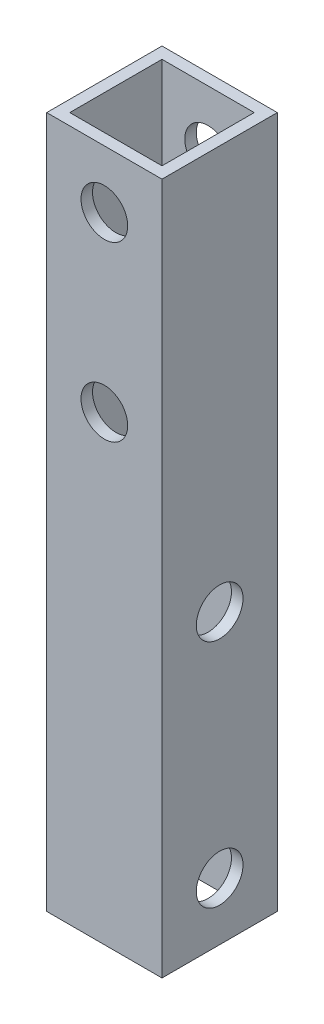
ISO-10303-21;
HEADER;
FILE_DESCRIPTION(('STEP AP214'),'2;1');
FILE_NAME('part.step','',(''),(''),'','','');
FILE_SCHEMA(('AUTOMOTIVE_DESIGN { 1 0 10303 214 1 1 1 1 }'));
ENDSEC;
DATA;
#1=APPLICATION_CONTEXT('core data for automotive mechanical design processes');
#2=APPLICATION_PROTOCOL_DEFINITION('international standard','automotive_design',2000,#1);
#3=PRODUCT_CONTEXT('',#1,'mechanical');
#4=PRODUCT('Part','Part','',(#3));
#5=PRODUCT_RELATED_PRODUCT_CATEGORY('part','',(#4));
#6=PRODUCT_DEFINITION_FORMATION('','',#4);
#7=PRODUCT_DEFINITION_CONTEXT('part definition',#1,'design');
#8=PRODUCT_DEFINITION('design','',#6,#7);
#9=PRODUCT_DEFINITION_SHAPE('','',#8);
#10=(LENGTH_UNIT() NAMED_UNIT(*) SI_UNIT(.MILLI.,.METRE.));
#11=(NAMED_UNIT(*) PLANE_ANGLE_UNIT() SI_UNIT($,.RADIAN.));
#12=(NAMED_UNIT(*) SI_UNIT($,.STERADIAN.) SOLID_ANGLE_UNIT());
#13=UNCERTAINTY_MEASURE_WITH_UNIT(LENGTH_MEASURE(1.E-05),#10,'distance_accuracy_value','');
#14=(GEOMETRIC_REPRESENTATION_CONTEXT(3) GLOBAL_UNCERTAINTY_ASSIGNED_CONTEXT((#13)) GLOBAL_UNIT_ASSIGNED_CONTEXT((#10,
#11,#12)) REPRESENTATION_CONTEXT('',''));
#15=CARTESIAN_POINT('',(0.,0.,0.));
#16=DIRECTION('',(0.,0.,1.));
#17=DIRECTION('',(1.,0.,0.));
#18=AXIS2_PLACEMENT_3D('',#15,#16,#17);
#19=CARTESIAN_POINT('',(0.,60.,0.));
#20=DIRECTION('',(0.,1.,0.));
#21=DIRECTION('',(0.,0.,1.));
#22=AXIS2_PLACEMENT_3D('',#19,#20,#21);
#23=PLANE('',#22);
#24=DIRECTION('',(0.,0.,-1.));
#25=VECTOR('',#24,1.);
#26=CARTESIAN_POINT('',(5.,60.,-5.));
#27=LINE('',#26,#25);
#28=CARTESIAN_POINT('',(5.,60.,5.));
#29=VERTEX_POINT('',#28);
#30=CARTESIAN_POINT('',(5.,60.,-5.));
#31=VERTEX_POINT('',#30);
#32=EDGE_CURVE('E156',#29,#31,#27,.T.);
#33=ORIENTED_EDGE('',*,*,#32,.T.);
#34=DIRECTION('',(-1.,0.,0.));
#35=VECTOR('',#34,1.);
#36=CARTESIAN_POINT('',(-5.,60.,-5.));
#37=LINE('',#36,#35);
#38=CARTESIAN_POINT('',(-5.,60.,-5.));
#39=VERTEX_POINT('',#38);
#40=EDGE_CURVE('E160',#31,#39,#37,.T.);
#41=ORIENTED_EDGE('',*,*,#40,.T.);
#42=DIRECTION('',(0.,0.,1.));
#43=VECTOR('',#42,1.);
#44=CARTESIAN_POINT('',(-5.,60.,-5.));
#45=LINE('',#44,#43);
#46=CARTESIAN_POINT('',(-5.,60.,5.));
#47=VERTEX_POINT('',#46);
#48=EDGE_CURVE('E164',#39,#47,#45,.T.);
#49=ORIENTED_EDGE('',*,*,#48,.T.);
#50=DIRECTION('',(1.,0.,0.));
#51=VECTOR('',#50,1.);
#52=CARTESIAN_POINT('',(-5.,60.,5.));
#53=LINE('',#52,#51);
#54=EDGE_CURVE('E167',#47,#29,#53,.T.);
#55=ORIENTED_EDGE('',*,*,#54,.T.);
#56=EDGE_LOOP('',(#33,#41,#49,#55));
#57=FACE_BOUND('',#56,.T.);
#58=DIRECTION('',(-1.,0.,0.));
#59=VECTOR('',#58,1.);
#60=CARTESIAN_POINT('',(-4.,60.,-4.));
#61=LINE('',#60,#59);
#62=CARTESIAN_POINT('',(4.,60.,-4.));
#63=VERTEX_POINT('',#62);
#64=CARTESIAN_POINT('',(-4.,60.,-4.));
#65=VERTEX_POINT('',#64);
#66=EDGE_CURVE('E115',#63,#65,#61,.T.);
#67=ORIENTED_EDGE('',*,*,#66,.F.);
#68=DIRECTION('',(0.,0.,-1.));
#69=VECTOR('',#68,1.);
#70=CARTESIAN_POINT('',(4.,60.,-4.));
#71=LINE('',#70,#69);
#72=CARTESIAN_POINT('',(4.,60.,4.));
#73=VERTEX_POINT('',#72);
#74=EDGE_CURVE('E106',#73,#63,#71,.T.);
#75=ORIENTED_EDGE('',*,*,#74,.F.);
#76=DIRECTION('',(1.,0.,0.));
#77=VECTOR('',#76,1.);
#78=CARTESIAN_POINT('',(-4.,60.,4.));
#79=LINE('',#78,#77);
#80=CARTESIAN_POINT('',(-4.,60.,4.));
#81=VERTEX_POINT('',#80);
#82=EDGE_CURVE('E132',#81,#73,#79,.T.);
#83=ORIENTED_EDGE('',*,*,#82,.F.);
#84=DIRECTION('',(0.,0.,1.));
#85=VECTOR('',#84,1.);
#86=CARTESIAN_POINT('',(-4.,60.,-4.));
#87=LINE('',#86,#85);
#88=EDGE_CURVE('E128',#65,#81,#87,.T.);
#89=ORIENTED_EDGE('',*,*,#88,.F.);
#90=EDGE_LOOP('',(#67,#75,#83,#89));
#91=FACE_BOUND('',#90,.T.);
#92=ADVANCED_FACE('F38',(#57,#91),#23,.T.);
#93=CARTESIAN_POINT('',(0.,0.,0.));
#94=DIRECTION('',(0.,1.,0.));
#95=DIRECTION('',(0.,0.,1.));
#96=AXIS2_PLACEMENT_3D('',#93,#94,#95);
#97=PLANE('',#96);
#98=DIRECTION('',(0.,0.,-1.));
#99=VECTOR('',#98,1.);
#100=CARTESIAN_POINT('',(5.,0.,-5.));
#101=LINE('',#100,#99);
#102=CARTESIAN_POINT('',(5.,0.,5.));
#103=VERTEX_POINT('',#102);
#104=CARTESIAN_POINT('',(5.,0.,-5.));
#105=VERTEX_POINT('',#104);
#106=EDGE_CURVE('E124',#103,#105,#101,.T.);
#107=ORIENTED_EDGE('',*,*,#106,.F.);
#108=DIRECTION('',(1.,0.,0.));
#109=VECTOR('',#108,1.);
#110=CARTESIAN_POINT('',(-5.,0.,5.));
#111=LINE('',#110,#109);
#112=CARTESIAN_POINT('',(-5.,0.,5.));
#113=VERTEX_POINT('',#112);
#114=EDGE_CURVE('E161',#113,#103,#111,.T.);
#115=ORIENTED_EDGE('',*,*,#114,.F.);
#116=DIRECTION('',(0.,0.,1.));
#117=VECTOR('',#116,1.);
#118=CARTESIAN_POINT('',(-5.,0.,-5.));
#119=LINE('',#118,#117);
#120=CARTESIAN_POINT('',(-5.,0.,-5.));
#121=VERTEX_POINT('',#120);
#122=EDGE_CURVE('E177',#121,#113,#119,.T.);
#123=ORIENTED_EDGE('',*,*,#122,.F.);
#124=DIRECTION('',(-1.,0.,0.));
#125=VECTOR('',#124,1.);
#126=CARTESIAN_POINT('',(-5.,0.,-5.));
#127=LINE('',#126,#125);
#128=EDGE_CURVE('E174',#105,#121,#127,.T.);
#129=ORIENTED_EDGE('',*,*,#128,.F.);
#130=EDGE_LOOP('',(#107,#115,#123,#129));
#131=FACE_BOUND('',#130,.T.);
#132=DIRECTION('',(0.,0.,-1.));
#133=VECTOR('',#132,1.);
#134=CARTESIAN_POINT('',(4.,0.,-4.));
#135=LINE('',#134,#133);
#136=CARTESIAN_POINT('',(4.,0.,4.));
#137=VERTEX_POINT('',#136);
#138=CARTESIAN_POINT('',(4.,0.,-4.));
#139=VERTEX_POINT('',#138);
#140=EDGE_CURVE('E64',#137,#139,#135,.T.);
#141=ORIENTED_EDGE('',*,*,#140,.T.);
#142=DIRECTION('',(-1.,0.,0.));
#143=VECTOR('',#142,1.);
#144=CARTESIAN_POINT('',(-4.,0.,-4.));
#145=LINE('',#144,#143);
#146=CARTESIAN_POINT('',(-4.,0.,-4.));
#147=VERTEX_POINT('',#146);
#148=EDGE_CURVE('E122',#139,#147,#145,.T.);
#149=ORIENTED_EDGE('',*,*,#148,.T.);
#150=DIRECTION('',(0.,0.,1.));
#151=VECTOR('',#150,1.);
#152=CARTESIAN_POINT('',(-4.,0.,-4.));
#153=LINE('',#152,#151);
#154=CARTESIAN_POINT('',(-4.,0.,4.));
#155=VERTEX_POINT('',#154);
#156=EDGE_CURVE('E143',#147,#155,#153,.T.);
#157=ORIENTED_EDGE('',*,*,#156,.T.);
#158=DIRECTION('',(1.,0.,0.));
#159=VECTOR('',#158,1.);
#160=CARTESIAN_POINT('',(-4.,0.,4.));
#161=LINE('',#160,#159);
#162=EDGE_CURVE('E116',#155,#137,#161,.T.);
#163=ORIENTED_EDGE('',*,*,#162,.T.);
#164=EDGE_LOOP('',(#141,#149,#157,#163));
#165=FACE_BOUND('',#164,.T.);
#166=ADVANCED_FACE('F274',(#131,#165),#97,.F.);
#167=CARTESIAN_POINT('',(5.,60.,-5.));
#168=DIRECTION('',(-1.,0.,0.));
#169=DIRECTION('',(0.,0.,1.));
#170=AXIS2_PLACEMENT_3D('',#167,#168,#169);
#171=PLANE('',#170);
#172=CARTESIAN_POINT('',(5.,5.,0.));
#173=DIRECTION('',(1.,0.,0.));
#174=DIRECTION('',(0.,0.,-1.));
#175=AXIS2_PLACEMENT_3D('',#172,#173,#174);
#176=CIRCLE('',#175,2.025);
#177=CARTESIAN_POINT('',(5.,5.,-2.025));
#178=VERTEX_POINT('',#177);
#179=EDGE_CURVE('E237',#178,#178,#176,.T.);
#180=ORIENTED_EDGE('',*,*,#179,.F.);
#181=EDGE_LOOP('',(#180));
#182=FACE_BOUND('',#181,.T.);
#183=CARTESIAN_POINT('',(5.,25.,0.));
#184=DIRECTION('',(1.,0.,0.));
#185=DIRECTION('',(0.,0.,-1.));
#186=AXIS2_PLACEMENT_3D('',#183,#184,#185);
#187=CIRCLE('',#186,2.025);
#188=CARTESIAN_POINT('',(5.,25.,-2.025));
#189=VERTEX_POINT('',#188);
#190=EDGE_CURVE('E233',#189,#189,#187,.T.);
#191=ORIENTED_EDGE('',*,*,#190,.F.);
#192=EDGE_LOOP('',(#191));
#193=FACE_BOUND('',#192,.T.);
#194=ORIENTED_EDGE('',*,*,#106,.T.);
#195=DIRECTION('',(0.,-1.,0.));
#196=VECTOR('',#195,1.);
#197=CARTESIAN_POINT('',(5.,60.,-5.));
#198=LINE('',#197,#196);
#199=EDGE_CURVE('E11',#31,#105,#198,.T.);
#200=ORIENTED_EDGE('',*,*,#199,.F.);
#201=ORIENTED_EDGE('',*,*,#32,.F.);
#202=DIRECTION('',(0.,-1.,0.));
#203=VECTOR('',#202,1.);
#204=CARTESIAN_POINT('',(5.,60.,5.));
#205=LINE('',#204,#203);
#206=EDGE_CURVE('E170',#29,#103,#205,.T.);
#207=ORIENTED_EDGE('',*,*,#206,.T.);
#208=EDGE_LOOP('',(#194,#200,#201,#207));
#209=FACE_BOUND('',#208,.T.);
#210=ADVANCED_FACE('F40',(#182,#193,#209),#171,.F.);
#211=CARTESIAN_POINT('',(-5.,60.,-5.));
#212=DIRECTION('',(0.,0.,1.));
#213=DIRECTION('',(1.,0.,0.));
#214=AXIS2_PLACEMENT_3D('',#211,#212,#213);
#215=PLANE('',#214);
#216=CARTESIAN_POINT('',(0.,55.,-5.));
#217=DIRECTION('',(0.,0.,1.));
#218=DIRECTION('',(1.,0.,0.));
#219=AXIS2_PLACEMENT_3D('',#216,#217,#218);
#220=CIRCLE('',#219,2.025);
#221=CARTESIAN_POINT('',(2.025,55.,-5.));
#222=VERTEX_POINT('',#221);
#223=EDGE_CURVE('E205',#222,#222,#220,.T.);
#224=ORIENTED_EDGE('',*,*,#223,.T.);
#225=EDGE_LOOP('',(#224));
#226=FACE_BOUND('',#225,.T.);
#227=CARTESIAN_POINT('',(0.,40.,-5.));
#228=DIRECTION('',(0.,0.,1.));
#229=DIRECTION('',(1.,0.,0.));
#230=AXIS2_PLACEMENT_3D('',#227,#228,#229);
#231=CIRCLE('',#230,2.025);
#232=CARTESIAN_POINT('',(2.025,40.,-5.));
#233=VERTEX_POINT('',#232);
#234=EDGE_CURVE('E219',#233,#233,#231,.T.);
#235=ORIENTED_EDGE('',*,*,#234,.T.);
#236=EDGE_LOOP('',(#235));
#237=FACE_BOUND('',#236,.T.);
#238=ORIENTED_EDGE('',*,*,#128,.T.);
#239=DIRECTION('',(0.,-1.,0.));
#240=VECTOR('',#239,1.);
#241=CARTESIAN_POINT('',(-5.,60.,-5.));
#242=LINE('',#241,#240);
#243=EDGE_CURVE('E48',#39,#121,#242,.T.);
#244=ORIENTED_EDGE('',*,*,#243,.F.);
#245=ORIENTED_EDGE('',*,*,#40,.F.);
#246=ORIENTED_EDGE('',*,*,#199,.T.);
#247=EDGE_LOOP('',(#238,#244,#245,#246));
#248=FACE_BOUND('',#247,.T.);
#249=ADVANCED_FACE('F273',(#226,#237,#248),#215,.F.);
#250=CARTESIAN_POINT('',(-5.,60.,-5.));
#251=DIRECTION('',(1.,0.,0.));
#252=DIRECTION('',(0.,0.,-1.));
#253=AXIS2_PLACEMENT_3D('',#250,#251,#252);
#254=PLANE('',#253);
#255=CARTESIAN_POINT('',(-5.,5.,0.));
#256=DIRECTION('',(1.,0.,0.));
#257=DIRECTION('',(0.,0.,-1.));
#258=AXIS2_PLACEMENT_3D('',#255,#256,#257);
#259=CIRCLE('',#258,2.025);
#260=CARTESIAN_POINT('',(-5.,5.,-2.025));
#261=VERTEX_POINT('',#260);
#262=EDGE_CURVE('E197',#261,#261,#259,.T.);
#263=ORIENTED_EDGE('',*,*,#262,.T.);
#264=EDGE_LOOP('',(#263));
#265=FACE_BOUND('',#264,.T.);
#266=CARTESIAN_POINT('',(-5.,25.,0.));
#267=DIRECTION('',(1.,0.,0.));
#268=DIRECTION('',(0.,0.,-1.));
#269=AXIS2_PLACEMENT_3D('',#266,#267,#268);
#270=CIRCLE('',#269,2.025);
#271=CARTESIAN_POINT('',(-5.,25.,-2.025));
#272=VERTEX_POINT('',#271);
#273=EDGE_CURVE('E241',#272,#272,#270,.T.);
#274=ORIENTED_EDGE('',*,*,#273,.T.);
#275=EDGE_LOOP('',(#274));
#276=FACE_BOUND('',#275,.T.);
#277=ORIENTED_EDGE('',*,*,#122,.T.);
#278=DIRECTION('',(0.,-1.,0.));
#279=VECTOR('',#278,1.);
#280=CARTESIAN_POINT('',(-5.,60.,5.));
#281=LINE('',#280,#279);
#282=EDGE_CURVE('E185',#47,#113,#281,.T.);
#283=ORIENTED_EDGE('',*,*,#282,.F.);
#284=ORIENTED_EDGE('',*,*,#48,.F.);
#285=ORIENTED_EDGE('',*,*,#243,.T.);
#286=EDGE_LOOP('',(#277,#283,#284,#285));
#287=FACE_BOUND('',#286,.T.);
#288=ADVANCED_FACE('F292',(#265,#276,#287),#254,.F.);
#289=CARTESIAN_POINT('',(-5.,60.,5.));
#290=DIRECTION('',(0.,0.,-1.));
#291=DIRECTION('',(-1.,0.,0.));
#292=AXIS2_PLACEMENT_3D('',#289,#290,#291);
#293=PLANE('',#292);
#294=CARTESIAN_POINT('',(0.,55.,5.));
#295=DIRECTION('',(0.,0.,1.));
#296=DIRECTION('',(1.,0.,0.));
#297=AXIS2_PLACEMENT_3D('',#294,#295,#296);
#298=CIRCLE('',#297,2.025);
#299=CARTESIAN_POINT('',(2.025,55.,5.));
#300=VERTEX_POINT('',#299);
#301=EDGE_CURVE('E213',#300,#300,#298,.T.);
#302=ORIENTED_EDGE('',*,*,#301,.F.);
#303=EDGE_LOOP('',(#302));
#304=FACE_BOUND('',#303,.T.);
#305=CARTESIAN_POINT('',(0.,40.,5.));
#306=DIRECTION('',(0.,0.,1.));
#307=DIRECTION('',(1.,0.,0.));
#308=AXIS2_PLACEMENT_3D('',#305,#306,#307);
#309=CIRCLE('',#308,2.025);
#310=CARTESIAN_POINT('',(2.025,40.,5.));
#311=VERTEX_POINT('',#310);
#312=EDGE_CURVE('E225',#311,#311,#309,.T.);
#313=ORIENTED_EDGE('',*,*,#312,.F.);
#314=EDGE_LOOP('',(#313));
#315=FACE_BOUND('',#314,.T.);
#316=ORIENTED_EDGE('',*,*,#114,.T.);
#317=ORIENTED_EDGE('',*,*,#206,.F.);
#318=ORIENTED_EDGE('',*,*,#54,.F.);
#319=ORIENTED_EDGE('',*,*,#282,.T.);
#320=EDGE_LOOP('',(#316,#317,#318,#319));
#321=FACE_BOUND('',#320,.T.);
#322=ADVANCED_FACE('F259',(#304,#315,#321),#293,.F.);
#323=CARTESIAN_POINT('',(4.,60.,-4.));
#324=DIRECTION('',(-1.,0.,0.));
#325=DIRECTION('',(0.,0.,1.));
#326=AXIS2_PLACEMENT_3D('',#323,#324,#325);
#327=PLANE('',#326);
#328=CARTESIAN_POINT('',(4.,5.,0.));
#329=DIRECTION('',(-1.,0.,0.));
#330=DIRECTION('',(0.,0.,1.));
#331=AXIS2_PLACEMENT_3D('',#328,#329,#330);
#332=CIRCLE('',#331,2.025);
#333=CARTESIAN_POINT('',(4.,5.,2.025));
#334=VERTEX_POINT('',#333);
#335=EDGE_CURVE('E140',#334,#334,#332,.T.);
#336=ORIENTED_EDGE('',*,*,#335,.F.);
#337=EDGE_LOOP('',(#336));
#338=FACE_BOUND('',#337,.T.);
#339=CARTESIAN_POINT('',(4.,25.,0.));
#340=DIRECTION('',(-1.,0.,0.));
#341=DIRECTION('',(0.,0.,1.));
#342=AXIS2_PLACEMENT_3D('',#339,#340,#341);
#343=CIRCLE('',#342,2.025);
#344=CARTESIAN_POINT('',(4.,25.,2.025));
#345=VERTEX_POINT('',#344);
#346=EDGE_CURVE('E196',#345,#345,#343,.T.);
#347=ORIENTED_EDGE('',*,*,#346,.F.);
#348=EDGE_LOOP('',(#347));
#349=FACE_BOUND('',#348,.T.);
#350=ORIENTED_EDGE('',*,*,#140,.F.);
#351=DIRECTION('',(0.,-1.,0.));
#352=VECTOR('',#351,1.);
#353=CARTESIAN_POINT('',(4.,60.,4.));
#354=LINE('',#353,#352);
#355=EDGE_CURVE('E110',#73,#137,#354,.T.);
#356=ORIENTED_EDGE('',*,*,#355,.F.);
#357=ORIENTED_EDGE('',*,*,#74,.T.);
#358=DIRECTION('',(0.,-1.,0.));
#359=VECTOR('',#358,1.);
#360=CARTESIAN_POINT('',(4.,60.,-4.));
#361=LINE('',#360,#359);
#362=EDGE_CURVE('E109',#63,#139,#361,.T.);
#363=ORIENTED_EDGE('',*,*,#362,.T.);
#364=EDGE_LOOP('',(#350,#356,#357,#363));
#365=FACE_BOUND('',#364,.T.);
#366=ADVANCED_FACE('F108',(#338,#349,#365),#327,.T.);
#367=CARTESIAN_POINT('',(-4.,60.,-4.));
#368=DIRECTION('',(0.,0.,1.));
#369=DIRECTION('',(1.,0.,0.));
#370=AXIS2_PLACEMENT_3D('',#367,#368,#369);
#371=PLANE('',#370);
#372=CARTESIAN_POINT('',(0.,55.,-4.));
#373=DIRECTION('',(0.,0.,1.));
#374=DIRECTION('',(1.,0.,0.));
#375=AXIS2_PLACEMENT_3D('',#372,#373,#374);
#376=CIRCLE('',#375,2.025);
#377=CARTESIAN_POINT('',(2.025,55.,-4.));
#378=VERTEX_POINT('',#377);
#379=EDGE_CURVE('E229',#378,#378,#376,.T.);
#380=ORIENTED_EDGE('',*,*,#379,.F.);
#381=EDGE_LOOP('',(#380));
#382=FACE_BOUND('',#381,.T.);
#383=CARTESIAN_POINT('',(0.,40.,-4.));
#384=DIRECTION('',(0.,0.,1.));
#385=DIRECTION('',(1.,0.,0.));
#386=AXIS2_PLACEMENT_3D('',#383,#384,#385);
#387=CIRCLE('',#386,2.025);
#388=CARTESIAN_POINT('',(2.025,40.,-4.));
#389=VERTEX_POINT('',#388);
#390=EDGE_CURVE('E204',#389,#389,#387,.T.);
#391=ORIENTED_EDGE('',*,*,#390,.F.);
#392=EDGE_LOOP('',(#391));
#393=FACE_BOUND('',#392,.T.);
#394=ORIENTED_EDGE('',*,*,#148,.F.);
#395=ORIENTED_EDGE('',*,*,#362,.F.);
#396=ORIENTED_EDGE('',*,*,#66,.T.);
#397=DIRECTION('',(0.,-1.,0.));
#398=VECTOR('',#397,1.);
#399=CARTESIAN_POINT('',(-4.,60.,-4.));
#400=LINE('',#399,#398);
#401=EDGE_CURVE('E125',#65,#147,#400,.T.);
#402=ORIENTED_EDGE('',*,*,#401,.T.);
#403=EDGE_LOOP('',(#394,#395,#396,#402));
#404=FACE_BOUND('',#403,.T.);
#405=ADVANCED_FACE('F119',(#382,#393,#404),#371,.T.);
#406=CARTESIAN_POINT('',(-4.,60.,-4.));
#407=DIRECTION('',(1.,0.,0.));
#408=DIRECTION('',(0.,0.,-1.));
#409=AXIS2_PLACEMENT_3D('',#406,#407,#408);
#410=PLANE('',#409);
#411=CARTESIAN_POINT('',(-4.,5.,0.));
#412=DIRECTION('',(1.,0.,0.));
#413=DIRECTION('',(0.,0.,-1.));
#414=AXIS2_PLACEMENT_3D('',#411,#412,#413);
#415=CIRCLE('',#414,2.025);
#416=CARTESIAN_POINT('',(-4.,5.,-2.025));
#417=VERTEX_POINT('',#416);
#418=EDGE_CURVE('E198',#417,#417,#415,.T.);
#419=ORIENTED_EDGE('',*,*,#418,.F.);
#420=EDGE_LOOP('',(#419));
#421=FACE_BOUND('',#420,.T.);
#422=CARTESIAN_POINT('',(-4.,25.,0.));
#423=DIRECTION('',(1.,0.,0.));
#424=DIRECTION('',(0.,0.,-1.));
#425=AXIS2_PLACEMENT_3D('',#422,#423,#424);
#426=CIRCLE('',#425,2.025);
#427=CARTESIAN_POINT('',(-4.,25.,-2.025));
#428=VERTEX_POINT('',#427);
#429=EDGE_CURVE('E192',#428,#428,#426,.T.);
#430=ORIENTED_EDGE('',*,*,#429,.F.);
#431=EDGE_LOOP('',(#430));
#432=FACE_BOUND('',#431,.T.);
#433=ORIENTED_EDGE('',*,*,#156,.F.);
#434=ORIENTED_EDGE('',*,*,#401,.F.);
#435=ORIENTED_EDGE('',*,*,#88,.T.);
#436=DIRECTION('',(0.,-1.,0.));
#437=VECTOR('',#436,1.);
#438=CARTESIAN_POINT('',(-4.,60.,4.));
#439=LINE('',#438,#437);
#440=EDGE_CURVE('E56',#81,#155,#439,.T.);
#441=ORIENTED_EDGE('',*,*,#440,.T.);
#442=EDGE_LOOP('',(#433,#434,#435,#441));
#443=FACE_BOUND('',#442,.T.);
#444=ADVANCED_FACE('F312',(#421,#432,#443),#410,.T.);
#445=CARTESIAN_POINT('',(-4.,60.,4.));
#446=DIRECTION('',(0.,0.,-1.));
#447=DIRECTION('',(-1.,0.,0.));
#448=AXIS2_PLACEMENT_3D('',#445,#446,#447);
#449=PLANE('',#448);
#450=CARTESIAN_POINT('',(0.,55.,4.));
#451=DIRECTION('',(0.,0.,-1.));
#452=DIRECTION('',(-1.,0.,0.));
#453=AXIS2_PLACEMENT_3D('',#450,#451,#452);
#454=CIRCLE('',#453,2.025);
#455=CARTESIAN_POINT('',(-2.025,55.,4.));
#456=VERTEX_POINT('',#455);
#457=EDGE_CURVE('E42',#456,#456,#454,.T.);
#458=ORIENTED_EDGE('',*,*,#457,.F.);
#459=EDGE_LOOP('',(#458));
#460=FACE_BOUND('',#459,.T.);
#461=CARTESIAN_POINT('',(0.,40.,4.));
#462=DIRECTION('',(0.,0.,-1.));
#463=DIRECTION('',(-1.,0.,0.));
#464=AXIS2_PLACEMENT_3D('',#461,#462,#463);
#465=CIRCLE('',#464,2.025);
#466=CARTESIAN_POINT('',(-2.025,40.,4.));
#467=VERTEX_POINT('',#466);
#468=EDGE_CURVE('E201',#467,#467,#465,.T.);
#469=ORIENTED_EDGE('',*,*,#468,.F.);
#470=EDGE_LOOP('',(#469));
#471=FACE_BOUND('',#470,.T.);
#472=ORIENTED_EDGE('',*,*,#162,.F.);
#473=ORIENTED_EDGE('',*,*,#440,.F.);
#474=ORIENTED_EDGE('',*,*,#82,.T.);
#475=ORIENTED_EDGE('',*,*,#355,.T.);
#476=EDGE_LOOP('',(#472,#473,#474,#475));
#477=FACE_BOUND('',#476,.T.);
#478=ADVANCED_FACE('F316',(#460,#471,#477),#449,.T.);
#479=CARTESIAN_POINT('',(-5.,25.,0.));
#480=DIRECTION('',(1.,0.,0.));
#481=DIRECTION('',(0.,0.,-1.));
#482=AXIS2_PLACEMENT_3D('',#479,#480,#481);
#483=CYLINDRICAL_SURFACE('',#482,2.025);
#484=ORIENTED_EDGE('',*,*,#429,.T.);
#485=EDGE_LOOP('',(#484));
#486=FACE_BOUND('',#485,.T.);
#487=ORIENTED_EDGE('',*,*,#273,.F.);
#488=EDGE_LOOP('',(#487));
#489=FACE_BOUND('',#488,.T.);
#490=ADVANCED_FACE('F268',(#486,#489),#483,.F.);
#491=CARTESIAN_POINT('',(-5.,5.,0.));
#492=DIRECTION('',(1.,0.,0.));
#493=DIRECTION('',(0.,0.,-1.));
#494=AXIS2_PLACEMENT_3D('',#491,#492,#493);
#495=CYLINDRICAL_SURFACE('',#494,2.025);
#496=ORIENTED_EDGE('',*,*,#418,.T.);
#497=EDGE_LOOP('',(#496));
#498=FACE_BOUND('',#497,.T.);
#499=ORIENTED_EDGE('',*,*,#262,.F.);
#500=EDGE_LOOP('',(#499));
#501=FACE_BOUND('',#500,.T.);
#502=ADVANCED_FACE('F266',(#498,#501),#495,.F.);
#503=ORIENTED_EDGE('',*,*,#346,.T.);
#504=EDGE_LOOP('',(#503));
#505=FACE_BOUND('',#504,.T.);
#506=ORIENTED_EDGE('',*,*,#190,.T.);
#507=EDGE_LOOP('',(#506));
#508=FACE_BOUND('',#507,.T.);
#509=ADVANCED_FACE('F263',(#505,#508),#483,.F.);
#510=ORIENTED_EDGE('',*,*,#335,.T.);
#511=EDGE_LOOP('',(#510));
#512=FACE_BOUND('',#511,.T.);
#513=ORIENTED_EDGE('',*,*,#179,.T.);
#514=EDGE_LOOP('',(#513));
#515=FACE_BOUND('',#514,.T.);
#516=ADVANCED_FACE('F254',(#512,#515),#495,.F.);
#517=CARTESIAN_POINT('',(0.,40.,-5.));
#518=DIRECTION('',(0.,0.,1.));
#519=DIRECTION('',(1.,0.,0.));
#520=AXIS2_PLACEMENT_3D('',#517,#518,#519);
#521=CYLINDRICAL_SURFACE('',#520,2.025);
#522=ORIENTED_EDGE('',*,*,#468,.T.);
#523=EDGE_LOOP('',(#522));
#524=FACE_BOUND('',#523,.T.);
#525=ORIENTED_EDGE('',*,*,#312,.T.);
#526=EDGE_LOOP('',(#525));
#527=FACE_BOUND('',#526,.T.);
#528=ADVANCED_FACE('F326',(#524,#527),#521,.F.);
#529=CARTESIAN_POINT('',(0.,55.,-5.));
#530=DIRECTION('',(0.,0.,1.));
#531=DIRECTION('',(1.,0.,0.));
#532=AXIS2_PLACEMENT_3D('',#529,#530,#531);
#533=CYLINDRICAL_SURFACE('',#532,2.025);
#534=ORIENTED_EDGE('',*,*,#457,.T.);
#535=EDGE_LOOP('',(#534));
#536=FACE_BOUND('',#535,.T.);
#537=ORIENTED_EDGE('',*,*,#301,.T.);
#538=EDGE_LOOP('',(#537));
#539=FACE_BOUND('',#538,.T.);
#540=ADVANCED_FACE('F329',(#536,#539),#533,.F.);
#541=ORIENTED_EDGE('',*,*,#390,.T.);
#542=EDGE_LOOP('',(#541));
#543=FACE_BOUND('',#542,.T.);
#544=ORIENTED_EDGE('',*,*,#234,.F.);
#545=EDGE_LOOP('',(#544));
#546=FACE_BOUND('',#545,.T.);
#547=ADVANCED_FACE('F330',(#543,#546),#521,.F.);
#548=ORIENTED_EDGE('',*,*,#379,.T.);
#549=EDGE_LOOP('',(#548));
#550=FACE_BOUND('',#549,.T.);
#551=ORIENTED_EDGE('',*,*,#223,.F.);
#552=EDGE_LOOP('',(#551));
#553=FACE_BOUND('',#552,.T.);
#554=ADVANCED_FACE('F333',(#550,#553),#533,.F.);
#555=CLOSED_SHELL('',(#92,#166,#210,#249,#288,#322,#366,#405,#444,#478,#490,#502,#509,#516,#528,
#540,#547,#554));
#556=MANIFOLD_SOLID_BREP('B2',#555);
#557=ADVANCED_BREP_SHAPE_REPRESENTATION('',(#18,#556),#14);
#558=SHAPE_DEFINITION_REPRESENTATION(#9,#557);
ENDSEC;
END-ISO-10303-21;
